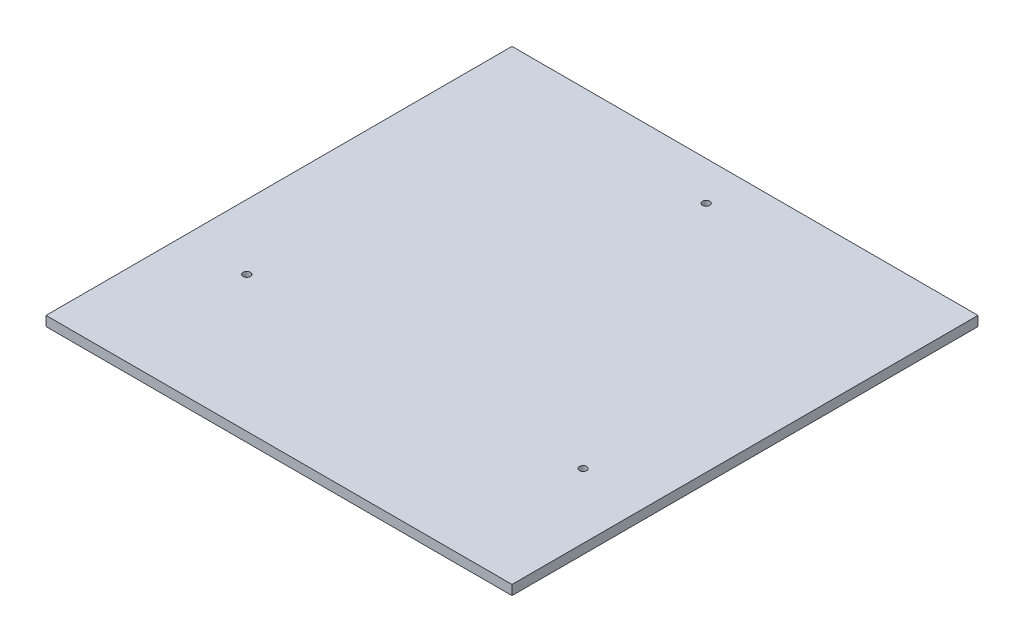
ISO-10303-21;
HEADER;
FILE_DESCRIPTION(('STEP AP214'),'2;1');
FILE_NAME('part.step','',(''),(''),'','','');
FILE_SCHEMA(('AUTOMOTIVE_DESIGN { 1 0 10303 214 1 1 1 1 }'));
ENDSEC;
DATA;
#1=APPLICATION_CONTEXT('core data for automotive mechanical design processes');
#2=APPLICATION_PROTOCOL_DEFINITION('international standard','automotive_design',2000,#1);
#3=PRODUCT_CONTEXT('',#1,'mechanical');
#4=PRODUCT('Part','Part','',(#3));
#5=PRODUCT_RELATED_PRODUCT_CATEGORY('part','',(#4));
#6=PRODUCT_DEFINITION_FORMATION('','',#4);
#7=PRODUCT_DEFINITION_CONTEXT('part definition',#1,'design');
#8=PRODUCT_DEFINITION('design','',#6,#7);
#9=PRODUCT_DEFINITION_SHAPE('','',#8);
#10=(LENGTH_UNIT() NAMED_UNIT(*) SI_UNIT(.MILLI.,.METRE.));
#11=(NAMED_UNIT(*) PLANE_ANGLE_UNIT() SI_UNIT($,.RADIAN.));
#12=(NAMED_UNIT(*) SI_UNIT($,.STERADIAN.) SOLID_ANGLE_UNIT());
#13=UNCERTAINTY_MEASURE_WITH_UNIT(LENGTH_MEASURE(1.E-05),#10,'distance_accuracy_value','');
#14=(GEOMETRIC_REPRESENTATION_CONTEXT(3) GLOBAL_UNCERTAINTY_ASSIGNED_CONTEXT((#13)) GLOBAL_UNIT_ASSIGNED_CONTEXT((#10,
#11,#12)) REPRESENTATION_CONTEXT('',''));
#15=CARTESIAN_POINT('',(0.,0.,0.));
#16=DIRECTION('',(0.,0.,1.));
#17=DIRECTION('',(1.,0.,0.));
#18=AXIS2_PLACEMENT_3D('',#15,#16,#17);
#19=CARTESIAN_POINT('',(0.,6.35,0.));
#20=DIRECTION('',(0.,0.,-1.));
#21=DIRECTION('',(-1.,0.,0.));
#22=AXIS2_PLACEMENT_3D('',#19,#20,#21);
#23=PLANE('',#22);
#24=DIRECTION('',(1.,0.,0.));
#25=VECTOR('',#24,1.);
#26=CARTESIAN_POINT('',(0.,0.,0.));
#27=LINE('',#26,#25);
#28=CARTESIAN_POINT('',(0.,0.,0.));
#29=VERTEX_POINT('',#28);
#30=CARTESIAN_POINT('',(304.8,0.,0.));
#31=VERTEX_POINT('',#30);
#32=EDGE_CURVE('E107',#29,#31,#27,.T.);
#33=ORIENTED_EDGE('',*,*,#32,.T.);
#34=DIRECTION('',(0.,-1.,0.));
#35=VECTOR('',#34,1.);
#36=CARTESIAN_POINT('',(304.8,6.35,0.));
#37=LINE('',#36,#35);
#38=CARTESIAN_POINT('',(304.8,6.35,0.));
#39=VERTEX_POINT('',#38);
#40=EDGE_CURVE('E11',#39,#31,#37,.T.);
#41=ORIENTED_EDGE('',*,*,#40,.F.);
#42=DIRECTION('',(1.,0.,0.));
#43=VECTOR('',#42,1.);
#44=CARTESIAN_POINT('',(0.,6.35,0.));
#45=LINE('',#44,#43);
#46=CARTESIAN_POINT('',(0.,6.35,0.));
#47=VERTEX_POINT('',#46);
#48=EDGE_CURVE('E89',#47,#39,#45,.T.);
#49=ORIENTED_EDGE('',*,*,#48,.F.);
#50=DIRECTION('',(0.,-1.,0.));
#51=VECTOR('',#50,1.);
#52=CARTESIAN_POINT('',(0.,6.35,0.));
#53=LINE('',#52,#51);
#54=EDGE_CURVE('E56',#47,#29,#53,.T.);
#55=ORIENTED_EDGE('',*,*,#54,.T.);
#56=EDGE_LOOP('',(#33,#41,#49,#55));
#57=FACE_BOUND('',#56,.T.);
#58=ADVANCED_FACE('F39',(#57),#23,.F.);
#59=CARTESIAN_POINT('',(304.8,6.35,0.));
#60=DIRECTION('',(-1.,0.,0.));
#61=DIRECTION('',(0.,0.,1.));
#62=AXIS2_PLACEMENT_3D('',#59,#60,#61);
#63=PLANE('',#62);
#64=DIRECTION('',(0.,0.,-1.));
#65=VECTOR('',#64,1.);
#66=CARTESIAN_POINT('',(304.8,0.,0.));
#67=LINE('',#66,#65);
#68=CARTESIAN_POINT('',(304.8,0.,-304.8));
#69=VERTEX_POINT('',#68);
#70=EDGE_CURVE('E95',#31,#69,#67,.T.);
#71=ORIENTED_EDGE('',*,*,#70,.T.);
#72=DIRECTION('',(0.,-1.,0.));
#73=VECTOR('',#72,1.);
#74=CARTESIAN_POINT('',(304.8,6.35,-304.8));
#75=LINE('',#74,#73);
#76=CARTESIAN_POINT('',(304.8,6.35,-304.8));
#77=VERTEX_POINT('',#76);
#78=EDGE_CURVE('E48',#77,#69,#75,.T.);
#79=ORIENTED_EDGE('',*,*,#78,.F.);
#80=DIRECTION('',(0.,0.,-1.));
#81=VECTOR('',#80,1.);
#82=CARTESIAN_POINT('',(304.8,6.35,0.));
#83=LINE('',#82,#81);
#84=EDGE_CURVE('E81',#39,#77,#83,.T.);
#85=ORIENTED_EDGE('',*,*,#84,.F.);
#86=ORIENTED_EDGE('',*,*,#40,.T.);
#87=EDGE_LOOP('',(#71,#79,#85,#86));
#88=FACE_BOUND('',#87,.T.);
#89=ADVANCED_FACE('F94',(#88),#63,.F.);
#90=CARTESIAN_POINT('',(0.,6.35,-304.8));
#91=DIRECTION('',(0.,0.,-1.));
#92=DIRECTION('',(-1.,0.,0.));
#93=AXIS2_PLACEMENT_3D('',#90,#91,#92);
#94=PLANE('',#93);
#95=DIRECTION('',(1.,0.,0.));
#96=VECTOR('',#95,1.);
#97=CARTESIAN_POINT('',(0.,0.,-304.8));
#98=LINE('',#97,#96);
#99=CARTESIAN_POINT('',(0.,0.,-304.8));
#100=VERTEX_POINT('',#99);
#101=EDGE_CURVE('E113',#100,#69,#98,.T.);
#102=ORIENTED_EDGE('',*,*,#101,.F.);
#103=DIRECTION('',(0.,-1.,0.));
#104=VECTOR('',#103,1.);
#105=CARTESIAN_POINT('',(0.,6.35,-304.8));
#106=LINE('',#105,#104);
#107=CARTESIAN_POINT('',(0.,6.35,-304.8));
#108=VERTEX_POINT('',#107);
#109=EDGE_CURVE('E70',#108,#100,#106,.T.);
#110=ORIENTED_EDGE('',*,*,#109,.F.);
#111=DIRECTION('',(1.,0.,0.));
#112=VECTOR('',#111,1.);
#113=CARTESIAN_POINT('',(0.,6.35,-304.8));
#114=LINE('',#113,#112);
#115=EDGE_CURVE('E88',#108,#77,#114,.T.);
#116=ORIENTED_EDGE('',*,*,#115,.T.);
#117=ORIENTED_EDGE('',*,*,#78,.T.);
#118=EDGE_LOOP('',(#102,#110,#116,#117));
#119=FACE_BOUND('',#118,.T.);
#120=ADVANCED_FACE('F99',(#119),#94,.T.);
#121=CARTESIAN_POINT('',(0.,6.35,0.));
#122=DIRECTION('',(-1.,0.,0.));
#123=DIRECTION('',(0.,0.,1.));
#124=AXIS2_PLACEMENT_3D('',#121,#122,#123);
#125=PLANE('',#124);
#126=DIRECTION('',(0.,0.,-1.));
#127=VECTOR('',#126,1.);
#128=CARTESIAN_POINT('',(0.,0.,0.));
#129=LINE('',#128,#127);
#130=EDGE_CURVE('E116',#29,#100,#129,.T.);
#131=ORIENTED_EDGE('',*,*,#130,.F.);
#132=ORIENTED_EDGE('',*,*,#54,.F.);
#133=DIRECTION('',(0.,0.,-1.));
#134=VECTOR('',#133,1.);
#135=CARTESIAN_POINT('',(0.,6.35,0.));
#136=LINE('',#135,#134);
#137=EDGE_CURVE('E101',#47,#108,#136,.T.);
#138=ORIENTED_EDGE('',*,*,#137,.T.);
#139=ORIENTED_EDGE('',*,*,#109,.T.);
#140=EDGE_LOOP('',(#131,#132,#138,#139));
#141=FACE_BOUND('',#140,.T.);
#142=ADVANCED_FACE('F162',(#141),#125,.T.);
#143=CARTESIAN_POINT('',(0.,6.35,0.));
#144=DIRECTION('',(0.,1.,0.));
#145=DIRECTION('',(0.,0.,1.));
#146=AXIS2_PLACEMENT_3D('',#143,#144,#145);
#147=PLANE('',#146);
#148=CARTESIAN_POINT('',(42.4147737193766,6.35,-88.8999999999995));
#149=DIRECTION('',(0.,1.,0.));
#150=DIRECTION('',(0.866025403784436,0.,-0.500000000000004));
#151=AXIS2_PLACEMENT_3D('',#148,#149,#150);
#152=CIRCLE('',#151,2.38125000000001);
#153=CARTESIAN_POINT('',(44.4769967121383,6.35,-90.0906249999995));
#154=VERTEX_POINT('',#153);
#155=EDGE_CURVE('E142',#154,#154,#152,.T.);
#156=ORIENTED_EDGE('',*,*,#155,.F.);
#157=EDGE_LOOP('',(#156));
#158=FACE_BOUND('',#157,.T.);
#159=CARTESIAN_POINT('',(262.385226280624,6.35,-88.9000000000011));
#160=DIRECTION('',(0.,1.,0.));
#161=DIRECTION('',(-0.866025403784443,0.,-0.499999999999992));
#162=AXIS2_PLACEMENT_3D('',#159,#160,#161);
#163=CIRCLE('',#162,2.38125000000001);
#164=CARTESIAN_POINT('',(260.323003287863,6.35,-90.0906250000011));
#165=VERTEX_POINT('',#164);
#166=EDGE_CURVE('E134',#165,#165,#163,.T.);
#167=ORIENTED_EDGE('',*,*,#166,.F.);
#168=EDGE_LOOP('',(#167));
#169=FACE_BOUND('',#168,.T.);
#170=CARTESIAN_POINT('',(152.4,6.35,-279.4));
#171=DIRECTION('',(0.,1.,0.));
#172=DIRECTION('',(0.,0.,1.));
#173=AXIS2_PLACEMENT_3D('',#170,#171,#172);
#174=CIRCLE('',#173,2.38125000000001);
#175=CARTESIAN_POINT('',(152.4,6.35,-277.01875));
#176=VERTEX_POINT('',#175);
#177=EDGE_CURVE('E126',#176,#176,#174,.T.);
#178=ORIENTED_EDGE('',*,*,#177,.F.);
#179=EDGE_LOOP('',(#178));
#180=FACE_BOUND('',#179,.T.);
#181=ORIENTED_EDGE('',*,*,#48,.T.);
#182=ORIENTED_EDGE('',*,*,#84,.T.);
#183=ORIENTED_EDGE('',*,*,#115,.F.);
#184=ORIENTED_EDGE('',*,*,#137,.F.);
#185=EDGE_LOOP('',(#181,#182,#183,#184));
#186=FACE_BOUND('',#185,.T.);
#187=ADVANCED_FACE('F85',(#158,#169,#180,#186),#147,.T.);
#188=CARTESIAN_POINT('',(0.,0.,0.));
#189=DIRECTION('',(0.,1.,0.));
#190=DIRECTION('',(0.,0.,1.));
#191=AXIS2_PLACEMENT_3D('',#188,#189,#190);
#192=PLANE('',#191);
#193=CARTESIAN_POINT('',(42.4147737193766,0.,-88.8999999999995));
#194=DIRECTION('',(0.,1.,0.));
#195=DIRECTION('',(0.866025403784436,0.,-0.500000000000004));
#196=AXIS2_PLACEMENT_3D('',#193,#194,#195);
#197=CIRCLE('',#196,2.38125000000001);
#198=CARTESIAN_POINT('',(44.4769967121383,0.,-90.0906249999995));
#199=VERTEX_POINT('',#198);
#200=EDGE_CURVE('E130',#199,#199,#197,.T.);
#201=ORIENTED_EDGE('',*,*,#200,.T.);
#202=EDGE_LOOP('',(#201));
#203=FACE_BOUND('',#202,.T.);
#204=CARTESIAN_POINT('',(262.385226280624,0.,-88.9000000000011));
#205=DIRECTION('',(0.,1.,0.));
#206=DIRECTION('',(-0.866025403784443,0.,-0.499999999999992));
#207=AXIS2_PLACEMENT_3D('',#204,#205,#206);
#208=CIRCLE('',#207,2.38125000000001);
#209=CARTESIAN_POINT('',(260.323003287863,0.,-90.0906250000011));
#210=VERTEX_POINT('',#209);
#211=EDGE_CURVE('E138',#210,#210,#208,.T.);
#212=ORIENTED_EDGE('',*,*,#211,.T.);
#213=EDGE_LOOP('',(#212));
#214=FACE_BOUND('',#213,.T.);
#215=CARTESIAN_POINT('',(152.4,0.,-279.4));
#216=DIRECTION('',(0.,1.,0.));
#217=DIRECTION('',(0.,0.,1.));
#218=AXIS2_PLACEMENT_3D('',#215,#216,#217);
#219=CIRCLE('',#218,2.38125000000001);
#220=CARTESIAN_POINT('',(152.4,0.,-277.01875));
#221=VERTEX_POINT('',#220);
#222=EDGE_CURVE('E110',#221,#221,#219,.T.);
#223=ORIENTED_EDGE('',*,*,#222,.T.);
#224=EDGE_LOOP('',(#223));
#225=FACE_BOUND('',#224,.T.);
#226=ORIENTED_EDGE('',*,*,#32,.F.);
#227=ORIENTED_EDGE('',*,*,#130,.T.);
#228=ORIENTED_EDGE('',*,*,#101,.T.);
#229=ORIENTED_EDGE('',*,*,#70,.F.);
#230=EDGE_LOOP('',(#226,#227,#228,#229));
#231=FACE_BOUND('',#230,.T.);
#232=ADVANCED_FACE('F150',(#203,#214,#225,#231),#192,.F.);
#233=CARTESIAN_POINT('',(152.4,0.,-279.4));
#234=DIRECTION('',(0.,1.,0.));
#235=DIRECTION('',(0.,0.,1.));
#236=AXIS2_PLACEMENT_3D('',#233,#234,#235);
#237=CYLINDRICAL_SURFACE('',#236,2.38125000000001);
#238=ORIENTED_EDGE('',*,*,#222,.F.);
#239=EDGE_LOOP('',(#238));
#240=FACE_BOUND('',#239,.T.);
#241=ORIENTED_EDGE('',*,*,#177,.T.);
#242=EDGE_LOOP('',(#241));
#243=FACE_BOUND('',#242,.T.);
#244=ADVANCED_FACE('F168',(#240,#243),#237,.F.);
#245=CARTESIAN_POINT('',(262.385226280624,0.,-88.9000000000011));
#246=DIRECTION('',(0.,1.,0.));
#247=DIRECTION('',(0.,0.,1.));
#248=AXIS2_PLACEMENT_3D('',#245,#246,#247);
#249=CYLINDRICAL_SURFACE('',#248,2.38125000000001);
#250=ORIENTED_EDGE('',*,*,#211,.F.);
#251=EDGE_LOOP('',(#250));
#252=FACE_BOUND('',#251,.T.);
#253=ORIENTED_EDGE('',*,*,#166,.T.);
#254=EDGE_LOOP('',(#253));
#255=FACE_BOUND('',#254,.T.);
#256=ADVANCED_FACE('F156',(#252,#255),#249,.F.);
#257=CARTESIAN_POINT('',(42.4147737193766,0.,-88.8999999999995));
#258=DIRECTION('',(0.,1.,0.));
#259=DIRECTION('',(0.,0.,1.));
#260=AXIS2_PLACEMENT_3D('',#257,#258,#259);
#261=CYLINDRICAL_SURFACE('',#260,2.38125000000001);
#262=ORIENTED_EDGE('',*,*,#200,.F.);
#263=EDGE_LOOP('',(#262));
#264=FACE_BOUND('',#263,.T.);
#265=ORIENTED_EDGE('',*,*,#155,.T.);
#266=EDGE_LOOP('',(#265));
#267=FACE_BOUND('',#266,.T.);
#268=ADVANCED_FACE('F153',(#264,#267),#261,.F.);
#269=CLOSED_SHELL('',(#58,#89,#120,#142,#187,#232,#244,#256,#268));
#270=MANIFOLD_SOLID_BREP('B2',#269);
#271=ADVANCED_BREP_SHAPE_REPRESENTATION('',(#18,#270),#14);
#272=SHAPE_DEFINITION_REPRESENTATION(#9,#271);
ENDSEC;
END-ISO-10303-21;
